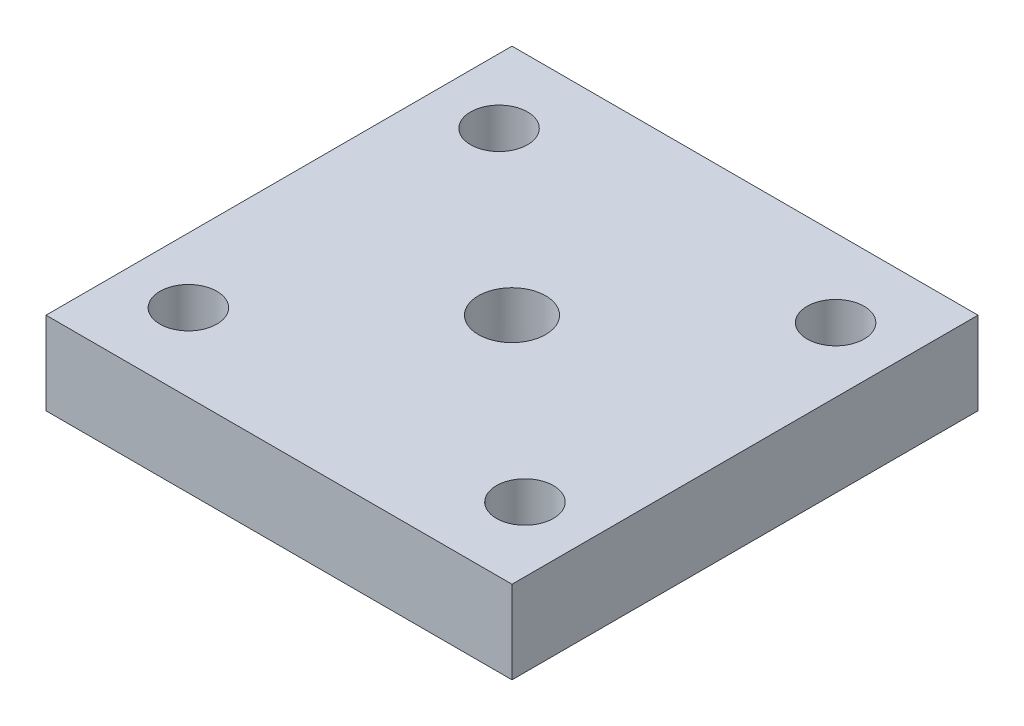
ISO-10303-21;
HEADER;
FILE_DESCRIPTION(('STEP AP214'),'2;1');
FILE_NAME('part.step','',(''),(''),'','','');
FILE_SCHEMA(('AUTOMOTIVE_DESIGN { 1 0 10303 214 1 1 1 1 }'));
ENDSEC;
DATA;
#1=APPLICATION_CONTEXT('core data for automotive mechanical design processes');
#2=APPLICATION_PROTOCOL_DEFINITION('international standard','automotive_design',2000,#1);
#3=PRODUCT_CONTEXT('',#1,'mechanical');
#4=PRODUCT('Part','Part','',(#3));
#5=PRODUCT_RELATED_PRODUCT_CATEGORY('part','',(#4));
#6=PRODUCT_DEFINITION_FORMATION('','',#4);
#7=PRODUCT_DEFINITION_CONTEXT('part definition',#1,'design');
#8=PRODUCT_DEFINITION('design','',#6,#7);
#9=PRODUCT_DEFINITION_SHAPE('','',#8);
#10=(LENGTH_UNIT() NAMED_UNIT(*) SI_UNIT(.MILLI.,.METRE.));
#11=(NAMED_UNIT(*) PLANE_ANGLE_UNIT() SI_UNIT($,.RADIAN.));
#12=(NAMED_UNIT(*) SI_UNIT($,.STERADIAN.) SOLID_ANGLE_UNIT());
#13=UNCERTAINTY_MEASURE_WITH_UNIT(LENGTH_MEASURE(1.E-05),#10,'distance_accuracy_value','');
#14=(GEOMETRIC_REPRESENTATION_CONTEXT(3) GLOBAL_UNCERTAINTY_ASSIGNED_CONTEXT((#13)) GLOBAL_UNIT_ASSIGNED_CONTEXT((#10,
#11,#12)) REPRESENTATION_CONTEXT('',''));
#15=CARTESIAN_POINT('',(0.,0.,0.));
#16=DIRECTION('',(0.,0.,1.));
#17=DIRECTION('',(1.,0.,0.));
#18=AXIS2_PLACEMENT_3D('',#15,#16,#17);
#19=CARTESIAN_POINT('',(0.,0.,0.));
#20=DIRECTION('',(0.,1.,0.));
#21=DIRECTION('',(0.,0.,1.));
#22=AXIS2_PLACEMENT_3D('',#19,#20,#21);
#23=CYLINDRICAL_SURFACE('',#22,3.25);
#24=CARTESIAN_POINT('',(0.,8.,0.));
#25=DIRECTION('',(0.,1.,0.));
#26=DIRECTION('',(0.,0.,1.));
#27=AXIS2_PLACEMENT_3D('',#24,#25,#26);
#28=CIRCLE('',#27,3.25);
#29=CARTESIAN_POINT('',(0.,8.,3.25));
#30=VERTEX_POINT('',#29);
#31=EDGE_CURVE('E164',#30,#30,#28,.T.);
#32=ORIENTED_EDGE('',*,*,#31,.T.);
#33=EDGE_LOOP('',(#32));
#34=FACE_BOUND('',#33,.T.);
#35=CARTESIAN_POINT('',(0.,3.,0.));
#36=DIRECTION('',(0.,-1.,0.));
#37=DIRECTION('',(0.,0.,-1.));
#38=AXIS2_PLACEMENT_3D('',#35,#36,#37);
#39=CIRCLE('',#38,3.25);
#40=CARTESIAN_POINT('',(0.,3.,-3.25));
#41=VERTEX_POINT('',#40);
#42=EDGE_CURVE('E50',#41,#41,#39,.F.);
#43=ORIENTED_EDGE('',*,*,#42,.F.);
#44=EDGE_LOOP('',(#43));
#45=FACE_BOUND('',#44,.T.);
#46=ADVANCED_FACE('F46',(#34,#45),#23,.F.);
#47=CARTESIAN_POINT('',(-22.5,8.,-22.5));
#48=DIRECTION('',(1.,0.,0.));
#49=DIRECTION('',(0.,0.,-1.));
#50=AXIS2_PLACEMENT_3D('',#47,#48,#49);
#51=PLANE('',#50);
#52=DIRECTION('',(0.,0.,1.));
#53=VECTOR('',#52,1.);
#54=CARTESIAN_POINT('',(-22.5,0.,-22.5));
#55=LINE('',#54,#53);
#56=CARTESIAN_POINT('',(-22.5,0.,-22.5));
#57=VERTEX_POINT('',#56);
#58=CARTESIAN_POINT('',(-22.5,0.,22.5));
#59=VERTEX_POINT('',#58);
#60=EDGE_CURVE('E127',#57,#59,#55,.T.);
#61=ORIENTED_EDGE('',*,*,#60,.T.);
#62=DIRECTION('',(0.,-1.,0.));
#63=VECTOR('',#62,1.);
#64=CARTESIAN_POINT('',(-22.5,8.,22.5));
#65=LINE('',#64,#63);
#66=CARTESIAN_POINT('',(-22.5,8.,22.5));
#67=VERTEX_POINT('',#66);
#68=EDGE_CURVE('E11',#67,#59,#65,.T.);
#69=ORIENTED_EDGE('',*,*,#68,.F.);
#70=DIRECTION('',(0.,0.,1.));
#71=VECTOR('',#70,1.);
#72=CARTESIAN_POINT('',(-22.5,8.,-22.5));
#73=LINE('',#72,#71);
#74=CARTESIAN_POINT('',(-22.5,8.,-22.5));
#75=VERTEX_POINT('',#74);
#76=EDGE_CURVE('E108',#75,#67,#73,.T.);
#77=ORIENTED_EDGE('',*,*,#76,.F.);
#78=DIRECTION('',(0.,-1.,0.));
#79=VECTOR('',#78,1.);
#80=CARTESIAN_POINT('',(-22.5,8.,-22.5));
#81=LINE('',#80,#79);
#82=EDGE_CURVE('E123',#75,#57,#81,.T.);
#83=ORIENTED_EDGE('',*,*,#82,.T.);
#84=EDGE_LOOP('',(#61,#69,#77,#83));
#85=FACE_BOUND('',#84,.T.);
#86=ADVANCED_FACE('F48',(#85),#51,.F.);
#87=CARTESIAN_POINT('',(-22.5,8.,22.5));
#88=DIRECTION('',(0.,0.,-1.));
#89=DIRECTION('',(-1.,0.,0.));
#90=AXIS2_PLACEMENT_3D('',#87,#88,#89);
#91=PLANE('',#90);
#92=DIRECTION('',(1.,0.,0.));
#93=VECTOR('',#92,1.);
#94=CARTESIAN_POINT('',(-22.5,0.,22.5));
#95=LINE('',#94,#93);
#96=CARTESIAN_POINT('',(22.5,0.,22.5));
#97=VERTEX_POINT('',#96);
#98=EDGE_CURVE('E113',#59,#97,#95,.T.);
#99=ORIENTED_EDGE('',*,*,#98,.T.);
#100=DIRECTION('',(0.,-1.,0.));
#101=VECTOR('',#100,1.);
#102=CARTESIAN_POINT('',(22.5,8.,22.5));
#103=LINE('',#102,#101);
#104=CARTESIAN_POINT('',(22.5,8.,22.5));
#105=VERTEX_POINT('',#104);
#106=EDGE_CURVE('E57',#105,#97,#103,.T.);
#107=ORIENTED_EDGE('',*,*,#106,.F.);
#108=DIRECTION('',(1.,0.,0.));
#109=VECTOR('',#108,1.);
#110=CARTESIAN_POINT('',(-22.5,8.,22.5));
#111=LINE('',#110,#109);
#112=EDGE_CURVE('E103',#67,#105,#111,.T.);
#113=ORIENTED_EDGE('',*,*,#112,.F.);
#114=ORIENTED_EDGE('',*,*,#68,.T.);
#115=EDGE_LOOP('',(#99,#107,#113,#114));
#116=FACE_BOUND('',#115,.T.);
#117=ADVANCED_FACE('F112',(#116),#91,.F.);
#118=CARTESIAN_POINT('',(22.5,8.,-22.5));
#119=DIRECTION('',(-1.,0.,0.));
#120=DIRECTION('',(0.,0.,1.));
#121=AXIS2_PLACEMENT_3D('',#118,#119,#120);
#122=PLANE('',#121);
#123=DIRECTION('',(0.,0.,-1.));
#124=VECTOR('',#123,1.);
#125=CARTESIAN_POINT('',(22.5,0.,-22.5));
#126=LINE('',#125,#124);
#127=CARTESIAN_POINT('',(22.5,0.,-22.5));
#128=VERTEX_POINT('',#127);
#129=EDGE_CURVE('E89',#97,#128,#126,.T.);
#130=ORIENTED_EDGE('',*,*,#129,.T.);
#131=DIRECTION('',(0.,-1.,0.));
#132=VECTOR('',#131,1.);
#133=CARTESIAN_POINT('',(22.5,8.,-22.5));
#134=LINE('',#133,#132);
#135=CARTESIAN_POINT('',(22.5,8.,-22.5));
#136=VERTEX_POINT('',#135);
#137=EDGE_CURVE('E115',#136,#128,#134,.T.);
#138=ORIENTED_EDGE('',*,*,#137,.F.);
#139=DIRECTION('',(0.,0.,-1.));
#140=VECTOR('',#139,1.);
#141=CARTESIAN_POINT('',(22.5,8.,-22.5));
#142=LINE('',#141,#140);
#143=EDGE_CURVE('E106',#105,#136,#142,.T.);
#144=ORIENTED_EDGE('',*,*,#143,.F.);
#145=ORIENTED_EDGE('',*,*,#106,.T.);
#146=EDGE_LOOP('',(#130,#138,#144,#145));
#147=FACE_BOUND('',#146,.T.);
#148=ADVANCED_FACE('F117',(#147),#122,.F.);
#149=CARTESIAN_POINT('',(-22.5,8.,-22.5));
#150=DIRECTION('',(0.,0.,1.));
#151=DIRECTION('',(1.,0.,0.));
#152=AXIS2_PLACEMENT_3D('',#149,#150,#151);
#153=PLANE('',#152);
#154=DIRECTION('',(-1.,0.,0.));
#155=VECTOR('',#154,1.);
#156=CARTESIAN_POINT('',(-22.5,0.,-22.5));
#157=LINE('',#156,#155);
#158=EDGE_CURVE('E96',#128,#57,#157,.T.);
#159=ORIENTED_EDGE('',*,*,#158,.T.);
#160=ORIENTED_EDGE('',*,*,#82,.F.);
#161=DIRECTION('',(-1.,0.,0.));
#162=VECTOR('',#161,1.);
#163=CARTESIAN_POINT('',(-22.5,8.,-22.5));
#164=LINE('',#163,#162);
#165=EDGE_CURVE('E68',#136,#75,#164,.T.);
#166=ORIENTED_EDGE('',*,*,#165,.F.);
#167=ORIENTED_EDGE('',*,*,#137,.T.);
#168=EDGE_LOOP('',(#159,#160,#166,#167));
#169=FACE_BOUND('',#168,.T.);
#170=ADVANCED_FACE('F143',(#169),#153,.F.);
#171=CARTESIAN_POINT('',(0.,8.,0.));
#172=DIRECTION('',(0.,1.,0.));
#173=DIRECTION('',(0.,0.,1.));
#174=AXIS2_PLACEMENT_3D('',#171,#172,#173);
#175=PLANE('',#174);
#176=ORIENTED_EDGE('',*,*,#31,.F.);
#177=EDGE_LOOP('',(#176));
#178=FACE_BOUND('',#177,.T.);
#179=CARTESIAN_POINT('',(-16.25,8.,15.));
#180=DIRECTION('',(0.,1.,0.));
#181=DIRECTION('',(0.,0.,1.));
#182=AXIS2_PLACEMENT_3D('',#179,#180,#181);
#183=CIRCLE('',#182,2.75);
#184=CARTESIAN_POINT('',(-16.25,8.,17.75));
#185=VERTEX_POINT('',#184);
#186=EDGE_CURVE('E159',#185,#185,#183,.T.);
#187=ORIENTED_EDGE('',*,*,#186,.F.);
#188=EDGE_LOOP('',(#187));
#189=FACE_BOUND('',#188,.T.);
#190=CARTESIAN_POINT('',(16.25,8.,15.));
#191=DIRECTION('',(0.,1.,0.));
#192=DIRECTION('',(0.,0.,1.));
#193=AXIS2_PLACEMENT_3D('',#190,#191,#192);
#194=CIRCLE('',#193,2.75);
#195=CARTESIAN_POINT('',(16.25,8.,17.75));
#196=VERTEX_POINT('',#195);
#197=EDGE_CURVE('E168',#196,#196,#194,.T.);
#198=ORIENTED_EDGE('',*,*,#197,.F.);
#199=EDGE_LOOP('',(#198));
#200=FACE_BOUND('',#199,.T.);
#201=CARTESIAN_POINT('',(16.25,8.,-15.));
#202=DIRECTION('',(0.,1.,0.));
#203=DIRECTION('',(0.,0.,1.));
#204=AXIS2_PLACEMENT_3D('',#201,#202,#203);
#205=CIRCLE('',#204,2.75);
#206=CARTESIAN_POINT('',(16.25,8.,-12.25));
#207=VERTEX_POINT('',#206);
#208=EDGE_CURVE('E175',#207,#207,#205,.T.);
#209=ORIENTED_EDGE('',*,*,#208,.F.);
#210=EDGE_LOOP('',(#209));
#211=FACE_BOUND('',#210,.T.);
#212=CARTESIAN_POINT('',(-16.25,8.,-15.));
#213=DIRECTION('',(0.,1.,0.));
#214=DIRECTION('',(0.,0.,1.));
#215=AXIS2_PLACEMENT_3D('',#212,#213,#214);
#216=CIRCLE('',#215,2.75);
#217=CARTESIAN_POINT('',(-16.25,8.,-12.25));
#218=VERTEX_POINT('',#217);
#219=EDGE_CURVE('E151',#218,#218,#216,.T.);
#220=ORIENTED_EDGE('',*,*,#219,.F.);
#221=EDGE_LOOP('',(#220));
#222=FACE_BOUND('',#221,.T.);
#223=ORIENTED_EDGE('',*,*,#76,.T.);
#224=ORIENTED_EDGE('',*,*,#112,.T.);
#225=ORIENTED_EDGE('',*,*,#143,.T.);
#226=ORIENTED_EDGE('',*,*,#165,.T.);
#227=EDGE_LOOP('',(#223,#224,#225,#226));
#228=FACE_BOUND('',#227,.T.);
#229=ADVANCED_FACE('F104',(#178,#189,#200,#211,#222,#228),#175,.T.);
#230=CARTESIAN_POINT('',(0.,0.,0.));
#231=DIRECTION('',(0.,1.,0.));
#232=DIRECTION('',(0.,0.,1.));
#233=AXIS2_PLACEMENT_3D('',#230,#231,#232);
#234=PLANE('',#233);
#235=CARTESIAN_POINT('',(0.,0.,0.));
#236=DIRECTION('',(0.,-1.,0.));
#237=DIRECTION('',(0.,0.,-1.));
#238=AXIS2_PLACEMENT_3D('',#235,#236,#237);
#239=CIRCLE('',#238,7.);
#240=CARTESIAN_POINT('',(0.,0.,-7.));
#241=VERTEX_POINT('',#240);
#242=EDGE_CURVE('E184',#241,#241,#239,.T.);
#243=ORIENTED_EDGE('',*,*,#242,.F.);
#244=EDGE_LOOP('',(#243));
#245=FACE_BOUND('',#244,.T.);
#246=CARTESIAN_POINT('',(-16.25,0.,15.));
#247=DIRECTION('',(0.,1.,0.));
#248=DIRECTION('',(0.,0.,1.));
#249=AXIS2_PLACEMENT_3D('',#246,#247,#248);
#250=CIRCLE('',#249,2.75);
#251=CARTESIAN_POINT('',(-16.25,0.,17.75));
#252=VERTEX_POINT('',#251);
#253=EDGE_CURVE('E163',#252,#252,#250,.T.);
#254=ORIENTED_EDGE('',*,*,#253,.T.);
#255=EDGE_LOOP('',(#254));
#256=FACE_BOUND('',#255,.T.);
#257=CARTESIAN_POINT('',(16.25,0.,15.));
#258=DIRECTION('',(0.,1.,0.));
#259=DIRECTION('',(0.,0.,1.));
#260=AXIS2_PLACEMENT_3D('',#257,#258,#259);
#261=CIRCLE('',#260,2.75);
#262=CARTESIAN_POINT('',(16.25,0.,17.75));
#263=VERTEX_POINT('',#262);
#264=EDGE_CURVE('E171',#263,#263,#261,.T.);
#265=ORIENTED_EDGE('',*,*,#264,.T.);
#266=EDGE_LOOP('',(#265));
#267=FACE_BOUND('',#266,.T.);
#268=CARTESIAN_POINT('',(16.25,0.,-15.));
#269=DIRECTION('',(0.,1.,0.));
#270=DIRECTION('',(0.,0.,1.));
#271=AXIS2_PLACEMENT_3D('',#268,#269,#270);
#272=CIRCLE('',#271,2.75);
#273=CARTESIAN_POINT('',(16.25,0.,-12.25));
#274=VERTEX_POINT('',#273);
#275=EDGE_CURVE('E155',#274,#274,#272,.T.);
#276=ORIENTED_EDGE('',*,*,#275,.T.);
#277=EDGE_LOOP('',(#276));
#278=FACE_BOUND('',#277,.T.);
#279=CARTESIAN_POINT('',(-16.25,0.,-15.));
#280=DIRECTION('',(0.,1.,0.));
#281=DIRECTION('',(0.,0.,1.));
#282=AXIS2_PLACEMENT_3D('',#279,#280,#281);
#283=CIRCLE('',#282,2.75);
#284=CARTESIAN_POINT('',(-16.25,0.,-12.25));
#285=VERTEX_POINT('',#284);
#286=EDGE_CURVE('E131',#285,#285,#283,.T.);
#287=ORIENTED_EDGE('',*,*,#286,.T.);
#288=EDGE_LOOP('',(#287));
#289=FACE_BOUND('',#288,.T.);
#290=ORIENTED_EDGE('',*,*,#60,.F.);
#291=ORIENTED_EDGE('',*,*,#158,.F.);
#292=ORIENTED_EDGE('',*,*,#129,.F.);
#293=ORIENTED_EDGE('',*,*,#98,.F.);
#294=EDGE_LOOP('',(#290,#291,#292,#293));
#295=FACE_BOUND('',#294,.T.);
#296=ADVANCED_FACE('F146',(#245,#256,#267,#278,#289,#295),#234,.F.);
#297=CARTESIAN_POINT('',(-16.25,0.,-15.));
#298=DIRECTION('',(0.,1.,0.));
#299=DIRECTION('',(0.,0.,1.));
#300=AXIS2_PLACEMENT_3D('',#297,#298,#299);
#301=CYLINDRICAL_SURFACE('',#300,2.75);
#302=ORIENTED_EDGE('',*,*,#286,.F.);
#303=EDGE_LOOP('',(#302));
#304=FACE_BOUND('',#303,.T.);
#305=ORIENTED_EDGE('',*,*,#219,.T.);
#306=EDGE_LOOP('',(#305));
#307=FACE_BOUND('',#306,.T.);
#308=ADVANCED_FACE('F215',(#304,#307),#301,.F.);
#309=CARTESIAN_POINT('',(16.25,0.,-15.));
#310=DIRECTION('',(0.,1.,0.));
#311=DIRECTION('',(0.,0.,1.));
#312=AXIS2_PLACEMENT_3D('',#309,#310,#311);
#313=CYLINDRICAL_SURFACE('',#312,2.75);
#314=ORIENTED_EDGE('',*,*,#275,.F.);
#315=EDGE_LOOP('',(#314));
#316=FACE_BOUND('',#315,.T.);
#317=ORIENTED_EDGE('',*,*,#208,.T.);
#318=EDGE_LOOP('',(#317));
#319=FACE_BOUND('',#318,.T.);
#320=ADVANCED_FACE('F211',(#316,#319),#313,.F.);
#321=CARTESIAN_POINT('',(16.25,0.,15.));
#322=DIRECTION('',(0.,1.,0.));
#323=DIRECTION('',(0.,0.,1.));
#324=AXIS2_PLACEMENT_3D('',#321,#322,#323);
#325=CYLINDRICAL_SURFACE('',#324,2.75);
#326=ORIENTED_EDGE('',*,*,#264,.F.);
#327=EDGE_LOOP('',(#326));
#328=FACE_BOUND('',#327,.T.);
#329=ORIENTED_EDGE('',*,*,#197,.T.);
#330=EDGE_LOOP('',(#329));
#331=FACE_BOUND('',#330,.T.);
#332=ADVANCED_FACE('F214',(#328,#331),#325,.F.);
#333=CARTESIAN_POINT('',(-16.25,0.,15.));
#334=DIRECTION('',(0.,1.,0.));
#335=DIRECTION('',(0.,0.,1.));
#336=AXIS2_PLACEMENT_3D('',#333,#334,#335);
#337=CYLINDRICAL_SURFACE('',#336,2.75);
#338=ORIENTED_EDGE('',*,*,#253,.F.);
#339=EDGE_LOOP('',(#338));
#340=FACE_BOUND('',#339,.T.);
#341=ORIENTED_EDGE('',*,*,#186,.T.);
#342=EDGE_LOOP('',(#341));
#343=FACE_BOUND('',#342,.T.);
#344=ADVANCED_FACE('F219',(#340,#343),#337,.F.);
#345=CARTESIAN_POINT('',(0.,3.,0.));
#346=DIRECTION('',(0.,-1.,0.));
#347=DIRECTION('',(0.,0.,-1.));
#348=AXIS2_PLACEMENT_3D('',#345,#346,#347);
#349=PLANE('',#348);
#350=CARTESIAN_POINT('',(0.,3.,0.));
#351=DIRECTION('',(0.,-1.,0.));
#352=DIRECTION('',(0.,0.,-1.));
#353=AXIS2_PLACEMENT_3D('',#350,#351,#352);
#354=CIRCLE('',#353,7.);
#355=CARTESIAN_POINT('',(0.,3.,-7.));
#356=VERTEX_POINT('',#355);
#357=EDGE_CURVE('E188',#356,#356,#354,.T.);
#358=ORIENTED_EDGE('',*,*,#357,.T.);
#359=EDGE_LOOP('',(#358));
#360=FACE_BOUND('',#359,.T.);
#361=ORIENTED_EDGE('',*,*,#42,.T.);
#362=EDGE_LOOP('',(#361));
#363=FACE_BOUND('',#362,.T.);
#364=ADVANCED_FACE('F199',(#360,#363),#349,.T.);
#365=CARTESIAN_POINT('',(0.,3.,0.));
#366=DIRECTION('',(0.,-1.,0.));
#367=DIRECTION('',(0.,0.,-1.));
#368=AXIS2_PLACEMENT_3D('',#365,#366,#367);
#369=CYLINDRICAL_SURFACE('',#368,7.);
#370=ORIENTED_EDGE('',*,*,#357,.F.);
#371=EDGE_LOOP('',(#370));
#372=FACE_BOUND('',#371,.T.);
#373=ORIENTED_EDGE('',*,*,#242,.T.);
#374=EDGE_LOOP('',(#373));
#375=FACE_BOUND('',#374,.T.);
#376=ADVANCED_FACE('F209',(#372,#375),#369,.F.);
#377=CLOSED_SHELL('',(#46,#86,#117,#148,#170,#229,#296,#308,#320,#332,#344,#364,#376));
#378=MANIFOLD_SOLID_BREP('B2',#377);
#379=ADVANCED_BREP_SHAPE_REPRESENTATION('',(#18,#378),#14);
#380=SHAPE_DEFINITION_REPRESENTATION(#9,#379);
ENDSEC;
END-ISO-10303-21;
